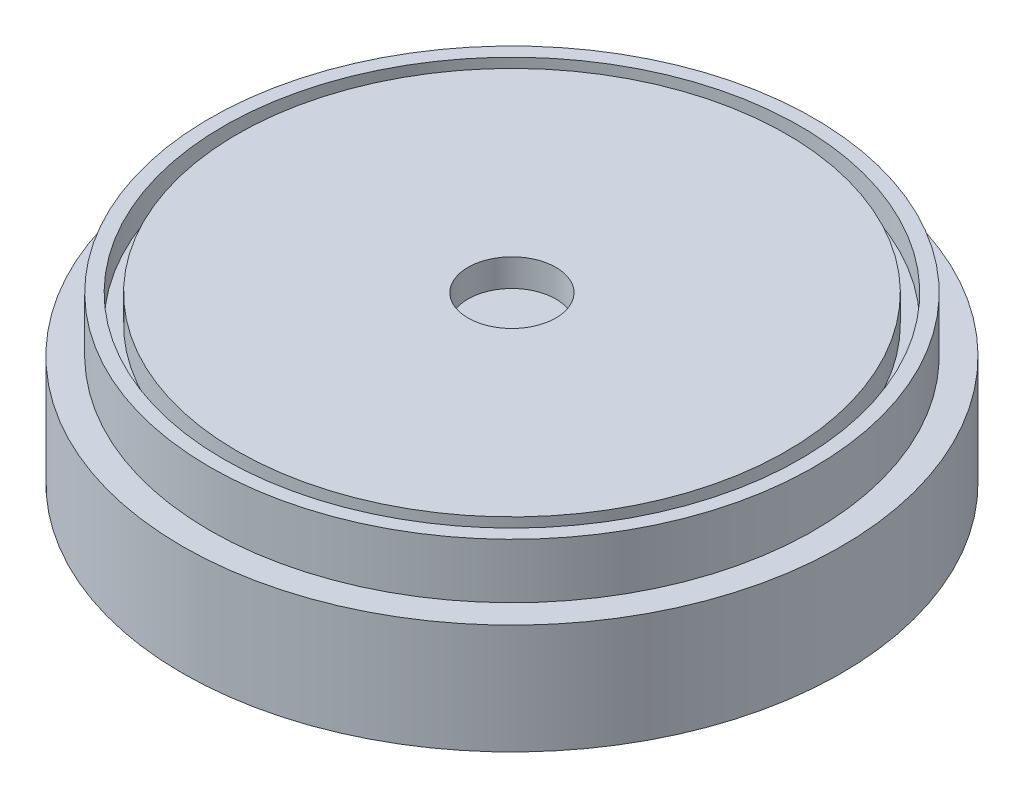
ISO-10303-21;
HEADER;
FILE_DESCRIPTION(('STEP AP214'),'2;1');
FILE_NAME('part.step','',(''),(''),'','','');
FILE_SCHEMA(('AUTOMOTIVE_DESIGN { 1 0 10303 214 1 1 1 1 }'));
ENDSEC;
DATA;
#1=APPLICATION_CONTEXT('core data for automotive mechanical design processes');
#2=APPLICATION_PROTOCOL_DEFINITION('international standard','automotive_design',2000,#1);
#3=PRODUCT_CONTEXT('',#1,'mechanical');
#4=PRODUCT('Part','Part','',(#3));
#5=PRODUCT_RELATED_PRODUCT_CATEGORY('part','',(#4));
#6=PRODUCT_DEFINITION_FORMATION('','',#4);
#7=PRODUCT_DEFINITION_CONTEXT('part definition',#1,'design');
#8=PRODUCT_DEFINITION('design','',#6,#7);
#9=PRODUCT_DEFINITION_SHAPE('','',#8);
#10=(LENGTH_UNIT() NAMED_UNIT(*) SI_UNIT(.MILLI.,.METRE.));
#11=(NAMED_UNIT(*) PLANE_ANGLE_UNIT() SI_UNIT($,.RADIAN.));
#12=(NAMED_UNIT(*) SI_UNIT($,.STERADIAN.) SOLID_ANGLE_UNIT());
#13=UNCERTAINTY_MEASURE_WITH_UNIT(LENGTH_MEASURE(1.E-05),#10,'distance_accuracy_value','');
#14=(GEOMETRIC_REPRESENTATION_CONTEXT(3) GLOBAL_UNCERTAINTY_ASSIGNED_CONTEXT((#13)) GLOBAL_UNIT_ASSIGNED_CONTEXT((#10,
#11,#12)) REPRESENTATION_CONTEXT('',''));
#15=CARTESIAN_POINT('',(0.,0.,0.));
#16=DIRECTION('',(0.,0.,1.));
#17=DIRECTION('',(1.,0.,0.));
#18=AXIS2_PLACEMENT_3D('',#15,#16,#17);
#19=CARTESIAN_POINT('',(0.,40.,0.));
#20=DIRECTION('',(0.,-1.,0.));
#21=DIRECTION('',(0.,0.,-1.));
#22=AXIS2_PLACEMENT_3D('',#19,#20,#21);
#23=CYLINDRICAL_SURFACE('',#22,120.);
#24=CARTESIAN_POINT('',(0.,40.,0.));
#25=DIRECTION('',(0.,1.,0.));
#26=DIRECTION('',(0.,0.,1.));
#27=AXIS2_PLACEMENT_3D('',#24,#25,#26);
#28=CIRCLE('',#27,120.);
#29=CARTESIAN_POINT('',(0.,40.,120.));
#30=VERTEX_POINT('',#29);
#31=EDGE_CURVE('E44',#30,#30,#28,.T.);
#32=ORIENTED_EDGE('',*,*,#31,.F.);
#33=EDGE_LOOP('',(#32));
#34=FACE_BOUND('',#33,.T.);
#35=CARTESIAN_POINT('',(0.,0.,0.));
#36=DIRECTION('',(0.,1.,0.));
#37=DIRECTION('',(0.,0.,1.));
#38=AXIS2_PLACEMENT_3D('',#35,#36,#37);
#39=CIRCLE('',#38,120.);
#40=CARTESIAN_POINT('',(0.,0.,120.));
#41=VERTEX_POINT('',#40);
#42=EDGE_CURVE('E40',#41,#41,#39,.T.);
#43=ORIENTED_EDGE('',*,*,#42,.T.);
#44=EDGE_LOOP('',(#43));
#45=FACE_BOUND('',#44,.T.);
#46=ADVANCED_FACE('F37',(#34,#45),#23,.T.);
#47=CARTESIAN_POINT('',(0.,40.,0.));
#48=DIRECTION('',(0.,1.,0.));
#49=DIRECTION('',(0.,0.,1.));
#50=AXIS2_PLACEMENT_3D('',#47,#48,#49);
#51=PLANE('',#50);
#52=CARTESIAN_POINT('',(0.,40.,0.));
#53=DIRECTION('',(0.,1.,0.));
#54=DIRECTION('',(0.,0.,1.));
#55=AXIS2_PLACEMENT_3D('',#52,#53,#54);
#56=CIRCLE('',#55,110.);
#57=CARTESIAN_POINT('',(0.,40.,110.));
#58=VERTEX_POINT('',#57);
#59=EDGE_CURVE('E11',#58,#58,#56,.T.);
#60=ORIENTED_EDGE('',*,*,#59,.F.);
#61=EDGE_LOOP('',(#60));
#62=FACE_BOUND('',#61,.T.);
#63=ORIENTED_EDGE('',*,*,#31,.T.);
#64=EDGE_LOOP('',(#63));
#65=FACE_BOUND('',#64,.T.);
#66=ADVANCED_FACE('F99',(#62,#65),#51,.T.);
#67=CARTESIAN_POINT('',(0.,0.,0.));
#68=DIRECTION('',(0.,1.,0.));
#69=DIRECTION('',(0.,0.,1.));
#70=AXIS2_PLACEMENT_3D('',#67,#68,#69);
#71=PLANE('',#70);
#72=ORIENTED_EDGE('',*,*,#42,.F.);
#73=EDGE_LOOP('',(#72));
#74=FACE_BOUND('',#73,.T.);
#75=ADVANCED_FACE('F104',(#74),#71,.F.);
#76=CARTESIAN_POINT('',(0.,60.,0.));
#77=DIRECTION('',(0.,-1.,0.));
#78=DIRECTION('',(0.,0.,-1.));
#79=AXIS2_PLACEMENT_3D('',#76,#77,#78);
#80=CYLINDRICAL_SURFACE('',#79,110.);
#81=CARTESIAN_POINT('',(0.,60.,0.));
#82=DIRECTION('',(0.,1.,0.));
#83=DIRECTION('',(0.,0.,1.));
#84=AXIS2_PLACEMENT_3D('',#81,#82,#83);
#85=CIRCLE('',#84,110.);
#86=CARTESIAN_POINT('',(0.,60.,110.));
#87=VERTEX_POINT('',#86);
#88=EDGE_CURVE('E50',#87,#87,#85,.T.);
#89=ORIENTED_EDGE('',*,*,#88,.F.);
#90=EDGE_LOOP('',(#89));
#91=FACE_BOUND('',#90,.T.);
#92=ORIENTED_EDGE('',*,*,#59,.T.);
#93=EDGE_LOOP('',(#92));
#94=FACE_BOUND('',#93,.T.);
#95=ADVANCED_FACE('F113',(#91,#94),#80,.T.);
#96=CARTESIAN_POINT('',(0.,60.,0.));
#97=DIRECTION('',(0.,1.,0.));
#98=DIRECTION('',(0.,0.,1.));
#99=AXIS2_PLACEMENT_3D('',#96,#97,#98);
#100=PLANE('',#99);
#101=CARTESIAN_POINT('',(0.,60.,0.));
#102=DIRECTION('',(0.,1.,0.));
#103=DIRECTION('',(0.,0.,1.));
#104=AXIS2_PLACEMENT_3D('',#101,#102,#103);
#105=CIRCLE('',#104,105.);
#106=CARTESIAN_POINT('',(0.,60.,105.));
#107=VERTEX_POINT('',#106);
#108=EDGE_CURVE('E54',#107,#107,#105,.T.);
#109=ORIENTED_EDGE('',*,*,#108,.F.);
#110=EDGE_LOOP('',(#109));
#111=FACE_BOUND('',#110,.T.);
#112=ORIENTED_EDGE('',*,*,#88,.T.);
#113=EDGE_LOOP('',(#112));
#114=FACE_BOUND('',#113,.T.);
#115=ADVANCED_FACE('F85',(#111,#114),#100,.T.);
#116=CARTESIAN_POINT('',(0.,50.,0.));
#117=DIRECTION('',(0.,1.,0.));
#118=DIRECTION('',(0.,0.,1.));
#119=AXIS2_PLACEMENT_3D('',#116,#117,#118);
#120=CYLINDRICAL_SURFACE('',#119,105.);
#121=CARTESIAN_POINT('',(0.,50.,0.));
#122=DIRECTION('',(0.,1.,0.));
#123=DIRECTION('',(0.,0.,1.));
#124=AXIS2_PLACEMENT_3D('',#121,#122,#123);
#125=CIRCLE('',#124,105.);
#126=CARTESIAN_POINT('',(0.,50.,105.));
#127=VERTEX_POINT('',#126);
#128=EDGE_CURVE('E53',#127,#127,#125,.T.);
#129=ORIENTED_EDGE('',*,*,#128,.F.);
#130=EDGE_LOOP('',(#129));
#131=FACE_BOUND('',#130,.T.);
#132=ORIENTED_EDGE('',*,*,#108,.T.);
#133=EDGE_LOOP('',(#132));
#134=FACE_BOUND('',#133,.T.);
#135=ADVANCED_FACE('F95',(#131,#134),#120,.F.);
#136=CARTESIAN_POINT('',(0.,50.,0.));
#137=DIRECTION('',(0.,1.,0.));
#138=DIRECTION('',(0.,0.,1.));
#139=AXIS2_PLACEMENT_3D('',#136,#137,#138);
#140=PLANE('',#139);
#141=CARTESIAN_POINT('',(0.,50.,0.));
#142=DIRECTION('',(0.,1.,0.));
#143=DIRECTION('',(0.,0.,1.));
#144=AXIS2_PLACEMENT_3D('',#141,#142,#143);
#145=CIRCLE('',#144,100.);
#146=CARTESIAN_POINT('',(0.,50.,100.));
#147=VERTEX_POINT('',#146);
#148=EDGE_CURVE('E57',#147,#147,#145,.T.);
#149=ORIENTED_EDGE('',*,*,#148,.F.);
#150=EDGE_LOOP('',(#149));
#151=FACE_BOUND('',#150,.T.);
#152=ORIENTED_EDGE('',*,*,#128,.T.);
#153=EDGE_LOOP('',(#152));
#154=FACE_BOUND('',#153,.T.);
#155=ADVANCED_FACE('F89',(#151,#154),#140,.T.);
#156=CARTESIAN_POINT('',(0.,50.,0.));
#157=DIRECTION('',(0.,1.,0.));
#158=DIRECTION('',(0.,0.,1.));
#159=AXIS2_PLACEMENT_3D('',#156,#157,#158);
#160=CYLINDRICAL_SURFACE('',#159,100.);
#161=ORIENTED_EDGE('',*,*,#148,.T.);
#162=EDGE_LOOP('',(#161));
#163=FACE_BOUND('',#162,.T.);
#164=CARTESIAN_POINT('',(0.,60.,0.));
#165=DIRECTION('',(0.,1.,0.));
#166=DIRECTION('',(0.,0.,1.));
#167=AXIS2_PLACEMENT_3D('',#164,#165,#166);
#168=CIRCLE('',#167,100.);
#169=CARTESIAN_POINT('',(0.,60.,100.));
#170=VERTEX_POINT('',#169);
#171=EDGE_CURVE('E60',#170,#170,#168,.T.);
#172=ORIENTED_EDGE('',*,*,#171,.F.);
#173=EDGE_LOOP('',(#172));
#174=FACE_BOUND('',#173,.T.);
#175=ADVANCED_FACE('F83',(#163,#174),#160,.T.);
#176=CARTESIAN_POINT('',(0.,60.,0.));
#177=DIRECTION('',(0.,1.,0.));
#178=DIRECTION('',(0.,0.,1.));
#179=AXIS2_PLACEMENT_3D('',#176,#177,#178);
#180=CIRCLE('',#179,16.);
#181=CARTESIAN_POINT('',(0.,60.,16.));
#182=VERTEX_POINT('',#181);
#183=EDGE_CURVE('E66',#182,#182,#180,.T.);
#184=ORIENTED_EDGE('',*,*,#183,.F.);
#185=EDGE_LOOP('',(#184));
#186=FACE_BOUND('',#185,.T.);
#187=ORIENTED_EDGE('',*,*,#171,.T.);
#188=EDGE_LOOP('',(#187));
#189=FACE_BOUND('',#188,.T.);
#190=ADVANCED_FACE('F77',(#186,#189),#100,.T.);
#191=CARTESIAN_POINT('',(0.,50.,0.));
#192=DIRECTION('',(0.,1.,0.));
#193=DIRECTION('',(0.,0.,1.));
#194=AXIS2_PLACEMENT_3D('',#191,#192,#193);
#195=CYLINDRICAL_SURFACE('',#194,16.);
#196=CARTESIAN_POINT('',(0.,50.,0.));
#197=DIRECTION('',(0.,1.,0.));
#198=DIRECTION('',(0.,0.,1.));
#199=AXIS2_PLACEMENT_3D('',#196,#197,#198);
#200=CIRCLE('',#199,16.);
#201=CARTESIAN_POINT('',(0.,50.,16.));
#202=VERTEX_POINT('',#201);
#203=EDGE_CURVE('E63',#202,#202,#200,.T.);
#204=ORIENTED_EDGE('',*,*,#203,.F.);
#205=EDGE_LOOP('',(#204));
#206=FACE_BOUND('',#205,.T.);
#207=ORIENTED_EDGE('',*,*,#183,.T.);
#208=EDGE_LOOP('',(#207));
#209=FACE_BOUND('',#208,.T.);
#210=ADVANCED_FACE('F74',(#206,#209),#195,.F.);
#211=CARTESIAN_POINT('',(0.,50.,0.));
#212=DIRECTION('',(0.,1.,0.));
#213=DIRECTION('',(0.,0.,1.));
#214=AXIS2_PLACEMENT_3D('',#211,#212,#213);
#215=PLANE('',#214);
#216=ORIENTED_EDGE('',*,*,#203,.T.);
#217=EDGE_LOOP('',(#216));
#218=FACE_BOUND('',#217,.T.);
#219=ADVANCED_FACE('F72',(#218),#215,.T.);
#220=CLOSED_SHELL('',(#46,#66,#75,#95,#115,#135,#155,#175,#190,#210,#219));
#221=MANIFOLD_SOLID_BREP('B2',#220);
#222=ADVANCED_BREP_SHAPE_REPRESENTATION('',(#18,#221),#14);
#223=SHAPE_DEFINITION_REPRESENTATION(#9,#222);
ENDSEC;
END-ISO-10303-21;
